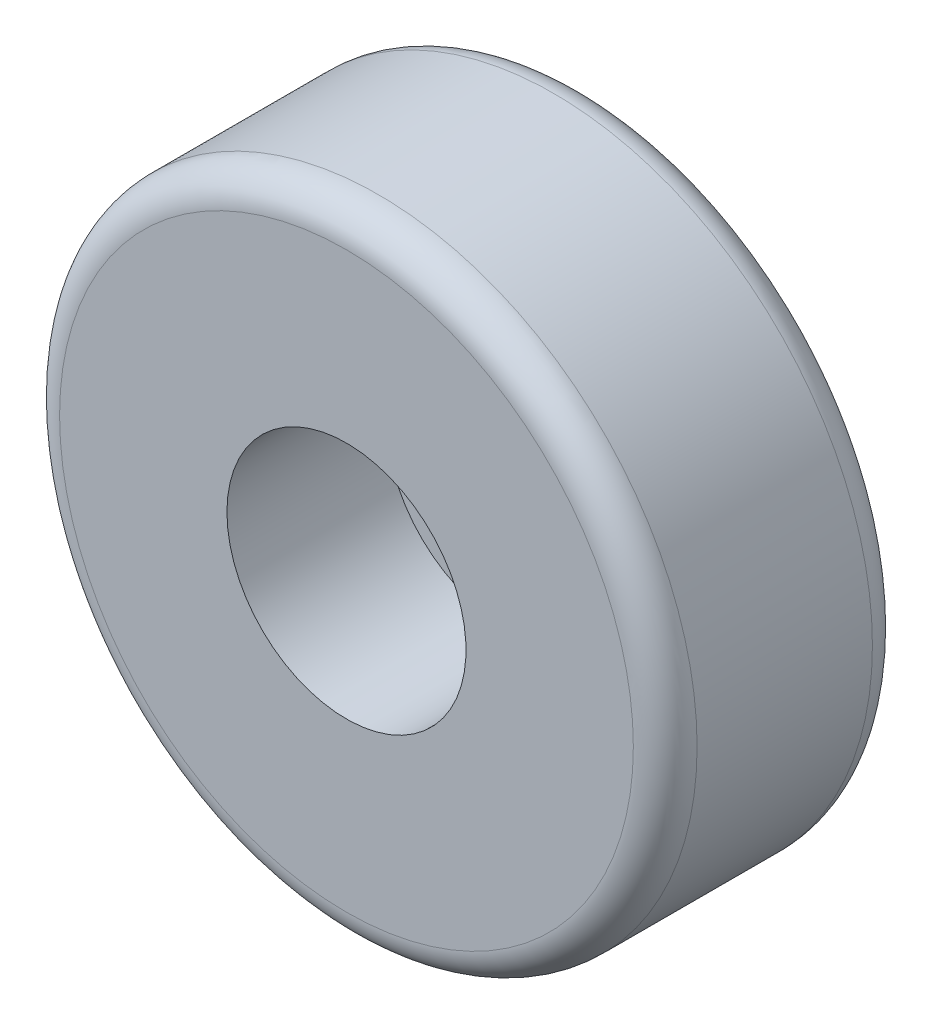
ISO-10303-21;
HEADER;
FILE_DESCRIPTION(('STEP AP214'),'2;1');
FILE_NAME('part.step','',(''),(''),'','','');
FILE_SCHEMA(('AUTOMOTIVE_DESIGN { 1 0 10303 214 1 1 1 1 }'));
ENDSEC;
DATA;
#1=APPLICATION_CONTEXT('core data for automotive mechanical design processes');
#2=APPLICATION_PROTOCOL_DEFINITION('international standard','automotive_design',2000,#1);
#3=PRODUCT_CONTEXT('',#1,'mechanical');
#4=PRODUCT('Part','Part','',(#3));
#5=PRODUCT_RELATED_PRODUCT_CATEGORY('part','',(#4));
#6=PRODUCT_DEFINITION_FORMATION('','',#4);
#7=PRODUCT_DEFINITION_CONTEXT('part definition',#1,'design');
#8=PRODUCT_DEFINITION('design','',#6,#7);
#9=PRODUCT_DEFINITION_SHAPE('','',#8);
#10=(LENGTH_UNIT() NAMED_UNIT(*) SI_UNIT(.MILLI.,.METRE.));
#11=(NAMED_UNIT(*) PLANE_ANGLE_UNIT() SI_UNIT($,.RADIAN.));
#12=(NAMED_UNIT(*) SI_UNIT($,.STERADIAN.) SOLID_ANGLE_UNIT());
#13=UNCERTAINTY_MEASURE_WITH_UNIT(LENGTH_MEASURE(1.E-05),#10,'distance_accuracy_value','');
#14=(GEOMETRIC_REPRESENTATION_CONTEXT(3) GLOBAL_UNCERTAINTY_ASSIGNED_CONTEXT((#13)) GLOBAL_UNIT_ASSIGNED_CONTEXT((#10,
#11,#12)) REPRESENTATION_CONTEXT('',''));
#15=CARTESIAN_POINT('',(0.,0.,0.));
#16=DIRECTION('',(0.,0.,1.));
#17=DIRECTION('',(1.,0.,0.));
#18=AXIS2_PLACEMENT_3D('',#15,#16,#17);
#19=CARTESIAN_POINT('',(0.,0.,76.2));
#20=DIRECTION('',(0.,0.,-1.));
#21=DIRECTION('',(-1.,0.,0.));
#22=AXIS2_PLACEMENT_3D('',#19,#20,#21);
#23=CYLINDRICAL_SURFACE('',#22,38.1);
#24=CARTESIAN_POINT('',(0.,0.,25.4));
#25=DIRECTION('',(0.,0.,1.));
#26=DIRECTION('',(1.,0.,0.));
#27=AXIS2_PLACEMENT_3D('',#24,#25,#26);
#28=CIRCLE('',#27,38.1);
#29=CARTESIAN_POINT('',(-38.1,0.,25.4));
#30=VERTEX_POINT('',#29);
#31=EDGE_CURVE('E59',#30,#30,#28,.T.);
#32=CARTESIAN_POINT('',(0.,0.,76.2));
#33=DIRECTION('',(0.,0.,1.));
#34=DIRECTION('',(1.,0.,0.));
#35=AXIS2_PLACEMENT_3D('',#32,#33,#34);
#36=CIRCLE('',#35,38.1);
#37=CARTESIAN_POINT('',(-38.1,0.,76.2));
#38=VERTEX_POINT('',#37);
#39=EDGE_CURVE('E62',#38,#38,#36,.T.);
#40=CARTESIAN_POINT('',(-38.1,0.,25.4));
#41=CARTESIAN_POINT('',(-38.1,0.,25.9291666666667));
#42=CARTESIAN_POINT('',(-38.1,0.,26.4583333333333));
#43=CARTESIAN_POINT('',(-38.1,0.,27.5166666666667));
#44=CARTESIAN_POINT('',(-38.1,0.,28.0458333333333));
#45=CARTESIAN_POINT('',(-38.1,0.,29.1041666666667));
#46=CARTESIAN_POINT('',(-38.1,0.,29.6333333333333));
#47=CARTESIAN_POINT('',(-38.1,0.,30.6916666666667));
#48=CARTESIAN_POINT('',(-38.1,0.,31.2208333333333));
#49=CARTESIAN_POINT('',(-38.1,0.,32.2791666666667));
#50=CARTESIAN_POINT('',(-38.1,0.,32.8083333333333));
#51=CARTESIAN_POINT('',(-38.1,0.,33.8666666666667));
#52=CARTESIAN_POINT('',(-38.1,0.,34.3958333333333));
#53=CARTESIAN_POINT('',(-38.1,0.,35.4541666666667));
#54=CARTESIAN_POINT('',(-38.1,0.,35.9833333333333));
#55=CARTESIAN_POINT('',(-38.1,0.,37.0416666666667));
#56=CARTESIAN_POINT('',(-38.1,0.,37.5708333333333));
#57=CARTESIAN_POINT('',(-38.1,0.,38.6291666666667));
#58=CARTESIAN_POINT('',(-38.1,0.,39.1583333333333));
#59=CARTESIAN_POINT('',(-38.1,0.,40.2166666666667));
#60=CARTESIAN_POINT('',(-38.1,0.,40.7458333333333));
#61=CARTESIAN_POINT('',(-38.1,0.,41.8041666666667));
#62=CARTESIAN_POINT('',(-38.1,0.,42.3333333333333));
#63=CARTESIAN_POINT('',(-38.1,0.,43.3916666666667));
#64=CARTESIAN_POINT('',(-38.1,0.,43.9208333333333));
#65=CARTESIAN_POINT('',(-38.1,0.,44.9791666666667));
#66=CARTESIAN_POINT('',(-38.1,0.,45.5083333333333));
#67=CARTESIAN_POINT('',(-38.1,0.,46.5666666666667));
#68=CARTESIAN_POINT('',(-38.1,0.,47.0958333333333));
#69=CARTESIAN_POINT('',(-38.1,0.,48.1541666666667));
#70=CARTESIAN_POINT('',(-38.1,0.,48.6833333333333));
#71=CARTESIAN_POINT('',(-38.1,0.,49.7416666666667));
#72=CARTESIAN_POINT('',(-38.1,0.,50.2708333333333));
#73=CARTESIAN_POINT('',(-38.1,0.,51.3291666666667));
#74=CARTESIAN_POINT('',(-38.1,0.,51.8583333333333));
#75=CARTESIAN_POINT('',(-38.1,0.,52.9166666666667));
#76=CARTESIAN_POINT('',(-38.1,0.,53.4458333333333));
#77=CARTESIAN_POINT('',(-38.1,0.,54.5041666666667));
#78=CARTESIAN_POINT('',(-38.1,0.,55.0333333333333));
#79=CARTESIAN_POINT('',(-38.1,0.,56.0916666666667));
#80=CARTESIAN_POINT('',(-38.1,0.,56.6208333333333));
#81=CARTESIAN_POINT('',(-38.1,0.,57.6791666666667));
#82=CARTESIAN_POINT('',(-38.1,0.,58.2083333333333));
#83=CARTESIAN_POINT('',(-38.1,0.,59.2666666666667));
#84=CARTESIAN_POINT('',(-38.1,0.,59.7958333333333));
#85=CARTESIAN_POINT('',(-38.1,0.,60.8541666666667));
#86=CARTESIAN_POINT('',(-38.1,0.,61.3833333333333));
#87=CARTESIAN_POINT('',(-38.1,0.,62.4416666666667));
#88=CARTESIAN_POINT('',(-38.1,0.,62.9708333333333));
#89=CARTESIAN_POINT('',(-38.1,0.,64.0291666666667));
#90=CARTESIAN_POINT('',(-38.1,0.,64.5583333333333));
#91=CARTESIAN_POINT('',(-38.1,0.,65.6166666666667));
#92=CARTESIAN_POINT('',(-38.1,0.,66.1458333333333));
#93=CARTESIAN_POINT('',(-38.1,0.,67.2041666666667));
#94=CARTESIAN_POINT('',(-38.1,0.,67.7333333333333));
#95=CARTESIAN_POINT('',(-38.1,0.,68.7916666666667));
#96=CARTESIAN_POINT('',(-38.1,0.,69.3208333333333));
#97=CARTESIAN_POINT('',(-38.1,0.,70.3791666666667));
#98=CARTESIAN_POINT('',(-38.1,0.,70.9083333333333));
#99=CARTESIAN_POINT('',(-38.1,0.,71.9666666666667));
#100=CARTESIAN_POINT('',(-38.1,0.,72.4958333333333));
#101=CARTESIAN_POINT('',(-38.1,0.,73.5541666666667));
#102=CARTESIAN_POINT('',(-38.1,0.,74.0833333333333));
#103=CARTESIAN_POINT('',(-38.1,0.,75.1416666666667));
#104=CARTESIAN_POINT('',(-38.1,0.,75.6708333333333));
#105=CARTESIAN_POINT('',(-38.1,0.,76.2));
#106=B_SPLINE_CURVE_WITH_KNOTS('',3,(#40,#41,#42,#43,#44,#45,#46,#47,#48,#49,#50,#51,#52,#53,
#54,#55,#56,#57,#58,#59,#60,#61,#62,#63,#64,#65,#66,#67,#68,#69,#70,#71,#72,#73,#74,#75,#76,#77,
#78,#79,#80,#81,#82,#83,#84,#85,#86,#87,#88,#89,#90,#91,#92,#93,#94,#95,#96,#97,#98,#99,#100,
#101,#102,#103,#104,#105),.UNSPECIFIED.,.F.,.F.,(4,2,2,2,2,2,2,2,2,2,2,2,2,2,2,2,2,2,2,2,2,2,2,
2,2,2,2,2,2,2,2,2,4),(0.,1.5875,3.175,4.7625,6.35,7.9375,9.525,11.1125,12.7,14.2875,15.875,
17.4625,19.05,20.6375,22.225,23.8125,25.4,26.9875,28.575,30.1625,31.75,33.3375,34.925,36.5125,
38.1,39.6875,41.275,42.8625,44.45,46.0375,47.625,49.2125,50.8),.UNSPECIFIED.);
#107=EDGE_CURVE('BSEAM39',#30,#38,#106,.T.);
#108=ORIENTED_EDGE('',*,*,#31,.F.);
#109=ORIENTED_EDGE('',*,*,#39,.T.);
#110=ORIENTED_EDGE('',*,*,#107,.T.);
#111=ORIENTED_EDGE('',*,*,#107,.F.);
#112=EDGE_LOOP('',(#108,#110,#109,#111));
#113=FACE_BOUND('',#112,.T.);
#114=ADVANCED_FACE('F39',(#113),#23,.F.);
#115=CARTESIAN_POINT('',(0.,0.,76.2));
#116=DIRECTION('',(0.,0.,-1.));
#117=DIRECTION('',(-1.,0.,0.));
#118=AXIS2_PLACEMENT_3D('',#115,#116,#117);
#119=CYLINDRICAL_SURFACE('',#118,101.6);
#120=CARTESIAN_POINT('',(0.,0.,66.04));
#121=DIRECTION('',(0.,0.,1.));
#122=DIRECTION('',(1.,0.,0.));
#123=AXIS2_PLACEMENT_3D('',#120,#121,#122);
#124=CIRCLE('',#123,101.6);
#125=CARTESIAN_POINT('',(-101.6,0.,66.04));
#126=VERTEX_POINT('',#125);
#127=EDGE_CURVE('E46',#126,#126,#124,.F.);
#128=CARTESIAN_POINT('',(0.,0.,10.16));
#129=DIRECTION('',(0.,0.,1.));
#130=DIRECTION('',(1.,0.,0.));
#131=AXIS2_PLACEMENT_3D('',#128,#129,#130);
#132=CIRCLE('',#131,101.6);
#133=CARTESIAN_POINT('',(-101.6,0.,10.16));
#134=VERTEX_POINT('',#133);
#135=EDGE_CURVE('E50',#134,#134,#132,.T.);
#136=CARTESIAN_POINT('',(-101.6,0.,66.04));
#137=CARTESIAN_POINT('',(-101.6,0.,65.4579166666667));
#138=CARTESIAN_POINT('',(-101.6,0.,64.8758333333333));
#139=CARTESIAN_POINT('',(-101.6,0.,63.7116666666667));
#140=CARTESIAN_POINT('',(-101.6,0.,63.1295833333333));
#141=CARTESIAN_POINT('',(-101.6,0.,61.9654166666667));
#142=CARTESIAN_POINT('',(-101.6,0.,61.3833333333333));
#143=CARTESIAN_POINT('',(-101.6,0.,60.2191666666667));
#144=CARTESIAN_POINT('',(-101.6,0.,59.6370833333333));
#145=CARTESIAN_POINT('',(-101.6,0.,58.4729166666667));
#146=CARTESIAN_POINT('',(-101.6,0.,57.8908333333333));
#147=CARTESIAN_POINT('',(-101.6,0.,56.7266666666667));
#148=CARTESIAN_POINT('',(-101.6,0.,56.1445833333333));
#149=CARTESIAN_POINT('',(-101.6,0.,54.9804166666667));
#150=CARTESIAN_POINT('',(-101.6,0.,54.3983333333333));
#151=CARTESIAN_POINT('',(-101.6,0.,53.2341666666667));
#152=CARTESIAN_POINT('',(-101.6,0.,52.6520833333333));
#153=CARTESIAN_POINT('',(-101.6,0.,51.4879166666667));
#154=CARTESIAN_POINT('',(-101.6,0.,50.9058333333333));
#155=CARTESIAN_POINT('',(-101.6,0.,49.7416666666667));
#156=CARTESIAN_POINT('',(-101.6,0.,49.1595833333333));
#157=CARTESIAN_POINT('',(-101.6,0.,47.9954166666667));
#158=CARTESIAN_POINT('',(-101.6,0.,47.4133333333333));
#159=CARTESIAN_POINT('',(-101.6,0.,46.2491666666667));
#160=CARTESIAN_POINT('',(-101.6,0.,45.6670833333333));
#161=CARTESIAN_POINT('',(-101.6,0.,44.5029166666667));
#162=CARTESIAN_POINT('',(-101.6,0.,43.9208333333333));
#163=CARTESIAN_POINT('',(-101.6,0.,42.7566666666667));
#164=CARTESIAN_POINT('',(-101.6,0.,42.1745833333333));
#165=CARTESIAN_POINT('',(-101.6,0.,41.0104166666667));
#166=CARTESIAN_POINT('',(-101.6,0.,40.4283333333333));
#167=CARTESIAN_POINT('',(-101.6,0.,39.2641666666667));
#168=CARTESIAN_POINT('',(-101.6,0.,38.6820833333333));
#169=CARTESIAN_POINT('',(-101.6,0.,37.5179166666667));
#170=CARTESIAN_POINT('',(-101.6,0.,36.9358333333333));
#171=CARTESIAN_POINT('',(-101.6,0.,35.7716666666667));
#172=CARTESIAN_POINT('',(-101.6,0.,35.1895833333333));
#173=CARTESIAN_POINT('',(-101.6,0.,34.0254166666667));
#174=CARTESIAN_POINT('',(-101.6,0.,33.4433333333333));
#175=CARTESIAN_POINT('',(-101.6,0.,32.2791666666667));
#176=CARTESIAN_POINT('',(-101.6,0.,31.6970833333333));
#177=CARTESIAN_POINT('',(-101.6,0.,30.5329166666667));
#178=CARTESIAN_POINT('',(-101.6,0.,29.9508333333333));
#179=CARTESIAN_POINT('',(-101.6,0.,28.7866666666667));
#180=CARTESIAN_POINT('',(-101.6,0.,28.2045833333333));
#181=CARTESIAN_POINT('',(-101.6,0.,27.0404166666667));
#182=CARTESIAN_POINT('',(-101.6,0.,26.4583333333333));
#183=CARTESIAN_POINT('',(-101.6,0.,25.2941666666667));
#184=CARTESIAN_POINT('',(-101.6,0.,24.7120833333333));
#185=CARTESIAN_POINT('',(-101.6,0.,23.5479166666667));
#186=CARTESIAN_POINT('',(-101.6,0.,22.9658333333333));
#187=CARTESIAN_POINT('',(-101.6,0.,21.8016666666667));
#188=CARTESIAN_POINT('',(-101.6,0.,21.2195833333333));
#189=CARTESIAN_POINT('',(-101.6,0.,20.0554166666667));
#190=CARTESIAN_POINT('',(-101.6,0.,19.4733333333333));
#191=CARTESIAN_POINT('',(-101.6,0.,18.3091666666667));
#192=CARTESIAN_POINT('',(-101.6,0.,17.7270833333333));
#193=CARTESIAN_POINT('',(-101.6,0.,16.5629166666667));
#194=CARTESIAN_POINT('',(-101.6,0.,15.9808333333333));
#195=CARTESIAN_POINT('',(-101.6,0.,14.8166666666667));
#196=CARTESIAN_POINT('',(-101.6,0.,14.2345833333333));
#197=CARTESIAN_POINT('',(-101.6,0.,13.0704166666667));
#198=CARTESIAN_POINT('',(-101.6,0.,12.4883333333333));
#199=CARTESIAN_POINT('',(-101.6,0.,11.3241666666667));
#200=CARTESIAN_POINT('',(-101.6,0.,10.7420833333333));
#201=CARTESIAN_POINT('',(-101.6,0.,10.16));
#202=B_SPLINE_CURVE_WITH_KNOTS('',3,(#136,#137,#138,#139,#140,#141,#142,#143,#144,#145,#146,
#147,#148,#149,#150,#151,#152,#153,#154,#155,#156,#157,#158,#159,#160,#161,#162,#163,#164,#165,
#166,#167,#168,#169,#170,#171,#172,#173,#174,#175,#176,#177,#178,#179,#180,#181,#182,#183,#184,
#185,#186,#187,#188,#189,#190,#191,#192,#193,#194,#195,#196,#197,#198,#199,#200,#201),
.UNSPECIFIED.,.F.,.F.,(4,2,2,2,2,2,2,2,2,2,2,2,2,2,2,2,2,2,2,2,2,2,2,2,2,2,2,2,2,2,2,2,4),(0.,
1.74625,3.49250000000001,5.23875000000001,6.985,8.73125000000001,10.4775,12.22375,13.97,
15.71625,17.4625,19.20875,20.955,22.70125,24.4475,26.19375,27.94,29.68625,31.4325,33.17875,
34.925,36.67125,38.4175,40.16375,41.91,43.65625,45.4025,47.14875,48.895,50.64125,52.3875,
54.13375,55.88),.UNSPECIFIED.);
#203=EDGE_CURVE('BSEAM106',#126,#134,#202,.T.);
#204=ORIENTED_EDGE('',*,*,#127,.T.);
#205=ORIENTED_EDGE('',*,*,#135,.T.);
#206=ORIENTED_EDGE('',*,*,#203,.T.);
#207=ORIENTED_EDGE('',*,*,#203,.F.);
#208=EDGE_LOOP('',(#204,#206,#205,#207));
#209=FACE_BOUND('',#208,.T.);
#210=ADVANCED_FACE('F106',(#209),#119,.T.);
#211=CARTESIAN_POINT('',(0.,0.,76.2));
#212=DIRECTION('',(0.,0.,1.));
#213=DIRECTION('',(1.,0.,0.));
#214=AXIS2_PLACEMENT_3D('',#211,#212,#213);
#215=PLANE('',#214);
#216=CARTESIAN_POINT('',(0.,0.,76.2));
#217=DIRECTION('',(0.,0.,1.));
#218=DIRECTION('',(1.,0.,0.));
#219=AXIS2_PLACEMENT_3D('',#216,#217,#218);
#220=CIRCLE('',#219,91.44);
#221=CARTESIAN_POINT('',(91.44,0.,76.2));
#222=VERTEX_POINT('',#221);
#223=EDGE_CURVE('E54',#222,#222,#220,.T.);
#224=ORIENTED_EDGE('',*,*,#223,.T.);
#225=EDGE_LOOP('',(#224));
#226=FACE_BOUND('',#225,.T.);
#227=ORIENTED_EDGE('',*,*,#39,.F.);
#228=EDGE_LOOP('',(#227));
#229=FACE_BOUND('',#228,.T.);
#230=ADVANCED_FACE('F96',(#226,#229),#215,.T.);
#231=CARTESIAN_POINT('',(0.,0.,0.));
#232=DIRECTION('',(0.,0.,1.));
#233=DIRECTION('',(1.,0.,0.));
#234=AXIS2_PLACEMENT_3D('',#231,#232,#233);
#235=PLANE('',#234);
#236=CARTESIAN_POINT('',(0.,0.,0.));
#237=DIRECTION('',(0.,0.,-1.));
#238=DIRECTION('',(-1.,0.,0.));
#239=AXIS2_PLACEMENT_3D('',#236,#237,#238);
#240=CIRCLE('',#239,74.8204659737735);
#241=CARTESIAN_POINT('',(-74.8204659737735,0.,0.));
#242=VERTEX_POINT('',#241);
#243=EDGE_CURVE('E66',#242,#242,#240,.T.);
#244=ORIENTED_EDGE('',*,*,#243,.F.);
#245=EDGE_LOOP('',(#244));
#246=FACE_BOUND('',#245,.T.);
#247=CARTESIAN_POINT('',(0.,0.,0.));
#248=DIRECTION('',(0.,0.,1.));
#249=DIRECTION('',(1.,0.,0.));
#250=AXIS2_PLACEMENT_3D('',#247,#248,#249);
#251=CIRCLE('',#250,91.44);
#252=CARTESIAN_POINT('',(91.44,0.,0.));
#253=VERTEX_POINT('',#252);
#254=EDGE_CURVE('E10',#253,#253,#251,.F.);
#255=ORIENTED_EDGE('',*,*,#254,.T.);
#256=EDGE_LOOP('',(#255));
#257=FACE_BOUND('',#256,.T.);
#258=ADVANCED_FACE('F93',(#246,#257),#235,.F.);
#259=CARTESIAN_POINT('',(0.,0.,25.4));
#260=DIRECTION('',(0.,0.,1.));
#261=DIRECTION('',(1.,0.,0.));
#262=AXIS2_PLACEMENT_3D('',#259,#260,#261);
#263=PLANE('',#262);
#264=ORIENTED_EDGE('',*,*,#31,.T.);
#265=EDGE_LOOP('',(#264));
#266=FACE_BOUND('',#265,.T.);
#267=ADVANCED_FACE('F95',(#266),#263,.T.);
#268=CARTESIAN_POINT('',(0.,0.,66.04));
#269=DIRECTION('',(0.,0.,1.));
#270=DIRECTION('',(1.,0.,0.));
#271=AXIS2_PLACEMENT_3D('',#268,#269,#270);
#272=TOROIDAL_SURFACE('',#271,91.44,10.16);
#273=ORIENTED_EDGE('',*,*,#127,.F.);
#274=EDGE_LOOP('',(#273));
#275=FACE_BOUND('',#274,.T.);
#276=ORIENTED_EDGE('',*,*,#223,.F.);
#277=EDGE_LOOP('',(#276));
#278=FACE_BOUND('',#277,.T.);
#279=ADVANCED_FACE('F103',(#275,#278),#272,.T.);
#280=CARTESIAN_POINT('',(0.,0.,10.16));
#281=DIRECTION('',(0.,0.,1.));
#282=DIRECTION('',(1.,0.,0.));
#283=AXIS2_PLACEMENT_3D('',#280,#281,#282);
#284=TOROIDAL_SURFACE('',#283,91.44,10.16);
#285=ORIENTED_EDGE('',*,*,#254,.F.);
#286=EDGE_LOOP('',(#285));
#287=FACE_BOUND('',#286,.T.);
#288=ORIENTED_EDGE('',*,*,#135,.F.);
#289=EDGE_LOOP('',(#288));
#290=FACE_BOUND('',#289,.T.);
#291=ADVANCED_FACE('F41',(#287,#290),#284,.T.);
#292=CARTESIAN_POINT('',(0.,0.,12.7));
#293=DIRECTION('',(0.,0.,-1.));
#294=DIRECTION('',(-1.,0.,0.));
#295=AXIS2_PLACEMENT_3D('',#292,#293,#294);
#296=CYLINDRICAL_SURFACE('',#295,74.8204659737735);
#297=CARTESIAN_POINT('',(0.,0.,12.7));
#298=DIRECTION('',(0.,0.,-1.));
#299=DIRECTION('',(-1.,0.,0.));
#300=AXIS2_PLACEMENT_3D('',#297,#298,#299);
#301=CIRCLE('',#300,74.8204659737735);
#302=CARTESIAN_POINT('',(-74.8204659737735,0.,12.7));
#303=VERTEX_POINT('',#302);
#304=EDGE_CURVE('E65',#303,#303,#301,.T.);
#305=CARTESIAN_POINT('',(-74.8204659737735,0.,12.7));
#306=CARTESIAN_POINT('',(-74.8204659737735,0.,12.5677083333333));
#307=CARTESIAN_POINT('',(-74.8204659737735,0.,12.4354166666667));
#308=CARTESIAN_POINT('',(-74.8204659737735,0.,12.1708333333333));
#309=CARTESIAN_POINT('',(-74.8204659737735,0.,12.0385416666667));
#310=CARTESIAN_POINT('',(-74.8204659737735,0.,11.7739583333333));
#311=CARTESIAN_POINT('',(-74.8204659737735,0.,11.6416666666667));
#312=CARTESIAN_POINT('',(-74.8204659737735,0.,11.3770833333333));
#313=CARTESIAN_POINT('',(-74.8204659737735,0.,11.2447916666667));
#314=CARTESIAN_POINT('',(-74.8204659737735,0.,10.9802083333333));
#315=CARTESIAN_POINT('',(-74.8204659737735,0.,10.8479166666667));
#316=CARTESIAN_POINT('',(-74.8204659737735,0.,10.5833333333333));
#317=CARTESIAN_POINT('',(-74.8204659737735,0.,10.4510416666667));
#318=CARTESIAN_POINT('',(-74.8204659737735,0.,10.1864583333333));
#319=CARTESIAN_POINT('',(-74.8204659737735,0.,10.0541666666667));
#320=CARTESIAN_POINT('',(-74.8204659737735,0.,9.78958333333334));
#321=CARTESIAN_POINT('',(-74.8204659737735,0.,9.65729166666667));
#322=CARTESIAN_POINT('',(-74.8204659737735,0.,9.39270833333333));
#323=CARTESIAN_POINT('',(-74.8204659737735,0.,9.26041666666667));
#324=CARTESIAN_POINT('',(-74.8204659737735,0.,8.99583333333334));
#325=CARTESIAN_POINT('',(-74.8204659737735,0.,8.86354166666667));
#326=CARTESIAN_POINT('',(-74.8204659737735,0.,8.59895833333334));
#327=CARTESIAN_POINT('',(-74.8204659737735,0.,8.46666666666667));
#328=CARTESIAN_POINT('',(-74.8204659737735,0.,8.20208333333334));
#329=CARTESIAN_POINT('',(-74.8204659737735,0.,8.06979166666667));
#330=CARTESIAN_POINT('',(-74.8204659737735,0.,7.80520833333333));
#331=CARTESIAN_POINT('',(-74.8204659737735,0.,7.67291666666667));
#332=CARTESIAN_POINT('',(-74.8204659737735,0.,7.40833333333333));
#333=CARTESIAN_POINT('',(-74.8204659737735,0.,7.27604166666667));
#334=CARTESIAN_POINT('',(-74.8204659737735,0.,7.01145833333333));
#335=CARTESIAN_POINT('',(-74.8204659737735,0.,6.87916666666667));
#336=CARTESIAN_POINT('',(-74.8204659737735,0.,6.61458333333333));
#337=CARTESIAN_POINT('',(-74.8204659737735,0.,6.48229166666667));
#338=CARTESIAN_POINT('',(-74.8204659737735,0.,6.21770833333333));
#339=CARTESIAN_POINT('',(-74.8204659737735,0.,6.08541666666667));
#340=CARTESIAN_POINT('',(-74.8204659737735,0.,5.82083333333333));
#341=CARTESIAN_POINT('',(-74.8204659737735,0.,5.68854166666667));
#342=CARTESIAN_POINT('',(-74.8204659737735,0.,5.42395833333333));
#343=CARTESIAN_POINT('',(-74.8204659737735,0.,5.29166666666667));
#344=CARTESIAN_POINT('',(-74.8204659737735,0.,5.02708333333333));
#345=CARTESIAN_POINT('',(-74.8204659737735,0.,4.89479166666667));
#346=CARTESIAN_POINT('',(-74.8204659737735,0.,4.63020833333333));
#347=CARTESIAN_POINT('',(-74.8204659737735,0.,4.49791666666667));
#348=CARTESIAN_POINT('',(-74.8204659737735,0.,4.23333333333333));
#349=CARTESIAN_POINT('',(-74.8204659737735,0.,4.10104166666667));
#350=CARTESIAN_POINT('',(-74.8204659737735,0.,3.83645833333333));
#351=CARTESIAN_POINT('',(-74.8204659737735,0.,3.70416666666667));
#352=CARTESIAN_POINT('',(-74.8204659737735,0.,3.43958333333333));
#353=CARTESIAN_POINT('',(-74.8204659737735,0.,3.30729166666667));
#354=CARTESIAN_POINT('',(-74.8204659737735,0.,3.04270833333333));
#355=CARTESIAN_POINT('',(-74.8204659737735,0.,2.91041666666667));
#356=CARTESIAN_POINT('',(-74.8204659737735,0.,2.64583333333333));
#357=CARTESIAN_POINT('',(-74.8204659737735,0.,2.51354166666667));
#358=CARTESIAN_POINT('',(-74.8204659737735,0.,2.24895833333333));
#359=CARTESIAN_POINT('',(-74.8204659737735,0.,2.11666666666667));
#360=CARTESIAN_POINT('',(-74.8204659737735,0.,1.85208333333333));
#361=CARTESIAN_POINT('',(-74.8204659737735,0.,1.71979166666667));
#362=CARTESIAN_POINT('',(-74.8204659737735,0.,1.45520833333333));
#363=CARTESIAN_POINT('',(-74.8204659737735,0.,1.32291666666667));
#364=CARTESIAN_POINT('',(-74.8204659737735,0.,1.05833333333333));
#365=CARTESIAN_POINT('',(-74.8204659737735,0.,0.926041666666666));
#366=CARTESIAN_POINT('',(-74.8204659737735,0.,0.661458333333333));
#367=CARTESIAN_POINT('',(-74.8204659737735,0.,0.529166666666666));
#368=CARTESIAN_POINT('',(-74.8204659737735,0.,0.264583333333333));
#369=CARTESIAN_POINT('',(-74.8204659737735,0.,0.132291666666667));
#370=CARTESIAN_POINT('',(-74.8204659737735,0.,0.));
#371=B_SPLINE_CURVE_WITH_KNOTS('',3,(#305,#306,#307,#308,#309,#310,#311,#312,#313,#314,#315,
#316,#317,#318,#319,#320,#321,#322,#323,#324,#325,#326,#327,#328,#329,#330,#331,#332,#333,#334,
#335,#336,#337,#338,#339,#340,#341,#342,#343,#344,#345,#346,#347,#348,#349,#350,#351,#352,#353,
#354,#355,#356,#357,#358,#359,#360,#361,#362,#363,#364,#365,#366,#367,#368,#369,#370),
.UNSPECIFIED.,.F.,.F.,(4,2,2,2,2,2,2,2,2,2,2,2,2,2,2,2,2,2,2,2,2,2,2,2,2,2,2,2,2,2,2,2,4),(0.,
0.396875,0.793749999999999,1.190625,1.5875,1.984375,2.38125,2.778125,3.175,3.571875,3.96875,
4.365625,4.7625,5.159375,5.55625,5.953125,6.35,6.746875,7.14375,7.540625,7.9375,8.334375,
8.73125,9.128125,9.525,9.921875,10.31875,10.715625,11.1125,11.509375,11.90625,12.303125,12.7),.UNSPECIFIED.);
#372=EDGE_CURVE('BSEAM84',#303,#242,#371,.T.);
#373=ORIENTED_EDGE('',*,*,#304,.F.);
#374=ORIENTED_EDGE('',*,*,#243,.T.);
#375=ORIENTED_EDGE('',*,*,#372,.T.);
#376=ORIENTED_EDGE('',*,*,#372,.F.);
#377=EDGE_LOOP('',(#373,#375,#374,#376));
#378=FACE_BOUND('',#377,.T.);
#379=ADVANCED_FACE('F84',(#378),#296,.F.);
#380=CARTESIAN_POINT('',(0.,0.,12.7));
#381=DIRECTION('',(0.,0.,-1.));
#382=DIRECTION('',(-1.,0.,0.));
#383=AXIS2_PLACEMENT_3D('',#380,#381,#382);
#384=PLANE('',#383);
#385=CARTESIAN_POINT('',(0.,0.,12.7));
#386=DIRECTION('',(0.,0.,-1.));
#387=DIRECTION('',(-1.,0.,0.));
#388=AXIS2_PLACEMENT_3D('',#385,#386,#387);
#389=CIRCLE('',#388,38.1);
#390=CARTESIAN_POINT('',(-38.1,0.,12.7));
#391=VERTEX_POINT('',#390);
#392=EDGE_CURVE('E69',#391,#391,#389,.T.);
#393=ORIENTED_EDGE('',*,*,#392,.F.);
#394=EDGE_LOOP('',(#393));
#395=FACE_BOUND('',#394,.T.);
#396=ORIENTED_EDGE('',*,*,#304,.T.);
#397=EDGE_LOOP('',(#396));
#398=FACE_BOUND('',#397,.T.);
#399=ADVANCED_FACE('F81',(#395,#398),#384,.T.);
#400=CARTESIAN_POINT('',(0.,0.,12.7));
#401=DIRECTION('',(0.,0.,-1.));
#402=DIRECTION('',(-1.,0.,0.));
#403=AXIS2_PLACEMENT_3D('',#400,#401,#402);
#404=CYLINDRICAL_SURFACE('',#403,38.1);
#405=CARTESIAN_POINT('',(0.,0.,0.));
#406=DIRECTION('',(0.,0.,-1.));
#407=DIRECTION('',(-1.,0.,0.));
#408=AXIS2_PLACEMENT_3D('',#405,#406,#407);
#409=CIRCLE('',#408,38.1);
#410=CARTESIAN_POINT('',(-38.1,0.,0.));
#411=VERTEX_POINT('',#410);
#412=EDGE_CURVE('E72',#411,#411,#409,.T.);
#413=CARTESIAN_POINT('',(-38.1,0.,12.7));
#414=CARTESIAN_POINT('',(-38.1,0.,12.5677083333333));
#415=CARTESIAN_POINT('',(-38.1,0.,12.4354166666667));
#416=CARTESIAN_POINT('',(-38.1,0.,12.1708333333333));
#417=CARTESIAN_POINT('',(-38.1,0.,12.0385416666667));
#418=CARTESIAN_POINT('',(-38.1,0.,11.7739583333333));
#419=CARTESIAN_POINT('',(-38.1,0.,11.6416666666667));
#420=CARTESIAN_POINT('',(-38.1,0.,11.3770833333333));
#421=CARTESIAN_POINT('',(-38.1,0.,11.2447916666667));
#422=CARTESIAN_POINT('',(-38.1,0.,10.9802083333333));
#423=CARTESIAN_POINT('',(-38.1,0.,10.8479166666667));
#424=CARTESIAN_POINT('',(-38.1,0.,10.5833333333333));
#425=CARTESIAN_POINT('',(-38.1,0.,10.4510416666667));
#426=CARTESIAN_POINT('',(-38.1,0.,10.1864583333333));
#427=CARTESIAN_POINT('',(-38.1,0.,10.0541666666667));
#428=CARTESIAN_POINT('',(-38.1,0.,9.78958333333334));
#429=CARTESIAN_POINT('',(-38.1,0.,9.65729166666667));
#430=CARTESIAN_POINT('',(-38.1,0.,9.39270833333333));
#431=CARTESIAN_POINT('',(-38.1,0.,9.26041666666667));
#432=CARTESIAN_POINT('',(-38.1,0.,8.99583333333334));
#433=CARTESIAN_POINT('',(-38.1,0.,8.86354166666667));
#434=CARTESIAN_POINT('',(-38.1,0.,8.59895833333334));
#435=CARTESIAN_POINT('',(-38.1,0.,8.46666666666667));
#436=CARTESIAN_POINT('',(-38.1,0.,8.20208333333334));
#437=CARTESIAN_POINT('',(-38.1,0.,8.06979166666667));
#438=CARTESIAN_POINT('',(-38.1,0.,7.80520833333333));
#439=CARTESIAN_POINT('',(-38.1,0.,7.67291666666667));
#440=CARTESIAN_POINT('',(-38.1,0.,7.40833333333333));
#441=CARTESIAN_POINT('',(-38.1,0.,7.27604166666667));
#442=CARTESIAN_POINT('',(-38.1,0.,7.01145833333333));
#443=CARTESIAN_POINT('',(-38.1,0.,6.87916666666667));
#444=CARTESIAN_POINT('',(-38.1,0.,6.61458333333333));
#445=CARTESIAN_POINT('',(-38.1,0.,6.48229166666667));
#446=CARTESIAN_POINT('',(-38.1,0.,6.21770833333333));
#447=CARTESIAN_POINT('',(-38.1,0.,6.08541666666667));
#448=CARTESIAN_POINT('',(-38.1,0.,5.82083333333333));
#449=CARTESIAN_POINT('',(-38.1,0.,5.68854166666667));
#450=CARTESIAN_POINT('',(-38.1,0.,5.42395833333333));
#451=CARTESIAN_POINT('',(-38.1,0.,5.29166666666667));
#452=CARTESIAN_POINT('',(-38.1,0.,5.02708333333333));
#453=CARTESIAN_POINT('',(-38.1,0.,4.89479166666667));
#454=CARTESIAN_POINT('',(-38.1,0.,4.63020833333333));
#455=CARTESIAN_POINT('',(-38.1,0.,4.49791666666667));
#456=CARTESIAN_POINT('',(-38.1,0.,4.23333333333333));
#457=CARTESIAN_POINT('',(-38.1,0.,4.10104166666667));
#458=CARTESIAN_POINT('',(-38.1,0.,3.83645833333333));
#459=CARTESIAN_POINT('',(-38.1,0.,3.70416666666667));
#460=CARTESIAN_POINT('',(-38.1,0.,3.43958333333333));
#461=CARTESIAN_POINT('',(-38.1,0.,3.30729166666667));
#462=CARTESIAN_POINT('',(-38.1,0.,3.04270833333333));
#463=CARTESIAN_POINT('',(-38.1,0.,2.91041666666667));
#464=CARTESIAN_POINT('',(-38.1,0.,2.64583333333333));
#465=CARTESIAN_POINT('',(-38.1,0.,2.51354166666667));
#466=CARTESIAN_POINT('',(-38.1,0.,2.24895833333333));
#467=CARTESIAN_POINT('',(-38.1,0.,2.11666666666667));
#468=CARTESIAN_POINT('',(-38.1,0.,1.85208333333333));
#469=CARTESIAN_POINT('',(-38.1,0.,1.71979166666667));
#470=CARTESIAN_POINT('',(-38.1,0.,1.45520833333333));
#471=CARTESIAN_POINT('',(-38.1,0.,1.32291666666667));
#472=CARTESIAN_POINT('',(-38.1,0.,1.05833333333333));
#473=CARTESIAN_POINT('',(-38.1,0.,0.926041666666666));
#474=CARTESIAN_POINT('',(-38.1,0.,0.661458333333333));
#475=CARTESIAN_POINT('',(-38.1,0.,0.529166666666666));
#476=CARTESIAN_POINT('',(-38.1,0.,0.264583333333333));
#477=CARTESIAN_POINT('',(-38.1,0.,0.132291666666667));
#478=CARTESIAN_POINT('',(-38.1,0.,0.));
#479=B_SPLINE_CURVE_WITH_KNOTS('',3,(#413,#414,#415,#416,#417,#418,#419,#420,#421,#422,#423,
#424,#425,#426,#427,#428,#429,#430,#431,#432,#433,#434,#435,#436,#437,#438,#439,#440,#441,#442,
#443,#444,#445,#446,#447,#448,#449,#450,#451,#452,#453,#454,#455,#456,#457,#458,#459,#460,#461,
#462,#463,#464,#465,#466,#467,#468,#469,#470,#471,#472,#473,#474,#475,#476,#477,#478),
.UNSPECIFIED.,.F.,.F.,(4,2,2,2,2,2,2,2,2,2,2,2,2,2,2,2,2,2,2,2,2,2,2,2,2,2,2,2,2,2,2,2,4),(0.,
0.396875,0.793749999999999,1.190625,1.5875,1.984375,2.38125,2.778125,3.175,3.571875,3.96875,
4.365625,4.7625,5.159375,5.55625,5.953125,6.35,6.746875,7.14375,7.540625,7.9375,8.334375,
8.73125,9.128125,9.525,9.921875,10.31875,10.715625,11.1125,11.509375,11.90625,12.303125,12.7),.UNSPECIFIED.);
#480=EDGE_CURVE('BSEAM78',#391,#411,#479,.T.);
#481=ORIENTED_EDGE('',*,*,#392,.T.);
#482=ORIENTED_EDGE('',*,*,#412,.F.);
#483=ORIENTED_EDGE('',*,*,#480,.T.);
#484=ORIENTED_EDGE('',*,*,#480,.F.);
#485=EDGE_LOOP('',(#481,#483,#482,#484));
#486=FACE_BOUND('',#485,.T.);
#487=ADVANCED_FACE('F78',(#486),#404,.T.);
#488=ORIENTED_EDGE('',*,*,#412,.T.);
#489=EDGE_LOOP('',(#488));
#490=FACE_BOUND('',#489,.T.);
#491=ADVANCED_FACE('F98',(#490),#235,.F.);
#492=CLOSED_SHELL('',(#114,#210,#230,#258,#267,#279,#291,#379,#399,#487,#491));
#493=MANIFOLD_SOLID_BREP('B2',#492);
#494=ADVANCED_BREP_SHAPE_REPRESENTATION('',(#18,#493),#14);
#495=SHAPE_DEFINITION_REPRESENTATION(#9,#494);
ENDSEC;
END-ISO-10303-21;
